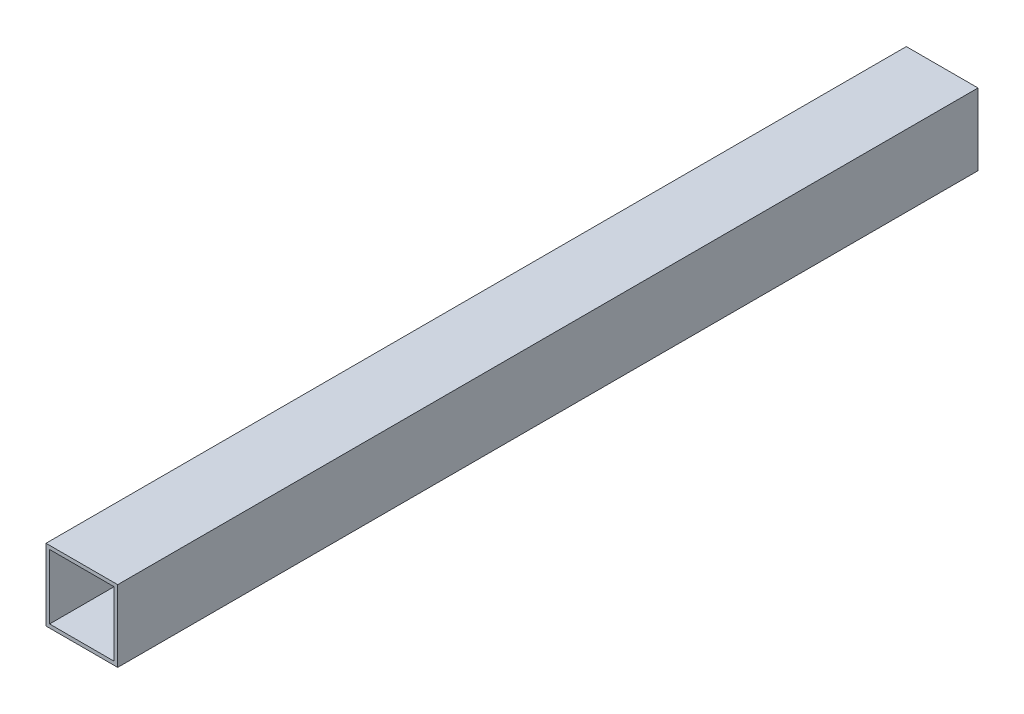
ISO-10303-21;
HEADER;
FILE_DESCRIPTION(('STEP AP214'),'2;1');
FILE_NAME('part.step','',(''),(''),'','','');
FILE_SCHEMA(('AUTOMOTIVE_DESIGN { 1 0 10303 214 1 1 1 1 }'));
ENDSEC;
DATA;
#1=APPLICATION_CONTEXT('core data for automotive mechanical design processes');
#2=APPLICATION_PROTOCOL_DEFINITION('international standard','automotive_design',2000,#1);
#3=PRODUCT_CONTEXT('',#1,'mechanical');
#4=PRODUCT('Part','Part','',(#3));
#5=PRODUCT_RELATED_PRODUCT_CATEGORY('part','',(#4));
#6=PRODUCT_DEFINITION_FORMATION('','',#4);
#7=PRODUCT_DEFINITION_CONTEXT('part definition',#1,'design');
#8=PRODUCT_DEFINITION('design','',#6,#7);
#9=PRODUCT_DEFINITION_SHAPE('','',#8);
#10=(LENGTH_UNIT() NAMED_UNIT(*) SI_UNIT(.MILLI.,.METRE.));
#11=(NAMED_UNIT(*) PLANE_ANGLE_UNIT() SI_UNIT($,.RADIAN.));
#12=(NAMED_UNIT(*) SI_UNIT($,.STERADIAN.) SOLID_ANGLE_UNIT());
#13=UNCERTAINTY_MEASURE_WITH_UNIT(LENGTH_MEASURE(1.E-05),#10,'distance_accuracy_value','');
#14=(GEOMETRIC_REPRESENTATION_CONTEXT(3) GLOBAL_UNCERTAINTY_ASSIGNED_CONTEXT((#13)) GLOBAL_UNIT_ASSIGNED_CONTEXT((#10,
#11,#12)) REPRESENTATION_CONTEXT('',''));
#15=CARTESIAN_POINT('',(0.,0.,0.));
#16=DIRECTION('',(0.,0.,1.));
#17=DIRECTION('',(1.,0.,0.));
#18=AXIS2_PLACEMENT_3D('',#15,#16,#17);
#19=CARTESIAN_POINT('',(0.,0.,300.));
#20=DIRECTION('',(0.,0.,-1.));
#21=DIRECTION('',(-1.,0.,0.));
#22=AXIS2_PLACEMENT_3D('',#19,#20,#21);
#23=PLANE('',#22);
#24=DIRECTION('',(0.,1.,0.));
#25=VECTOR('',#24,1.);
#26=CARTESIAN_POINT('',(25.,-25.,300.));
#27=LINE('',#26,#25);
#28=CARTESIAN_POINT('',(25.,-25.,300.));
#29=VERTEX_POINT('',#28);
#30=CARTESIAN_POINT('',(25.,25.,300.));
#31=VERTEX_POINT('',#30);
#32=EDGE_CURVE('E153',#29,#31,#27,.T.);
#33=ORIENTED_EDGE('',*,*,#32,.T.);
#34=DIRECTION('',(-1.,0.,0.));
#35=VECTOR('',#34,1.);
#36=CARTESIAN_POINT('',(-25.,25.,300.));
#37=LINE('',#36,#35);
#38=CARTESIAN_POINT('',(-25.,25.,300.));
#39=VERTEX_POINT('',#38);
#40=EDGE_CURVE('E157',#31,#39,#37,.T.);
#41=ORIENTED_EDGE('',*,*,#40,.T.);
#42=DIRECTION('',(0.,-1.,0.));
#43=VECTOR('',#42,1.);
#44=CARTESIAN_POINT('',(-25.,-25.,300.));
#45=LINE('',#44,#43);
#46=CARTESIAN_POINT('',(-25.,-25.,300.));
#47=VERTEX_POINT('',#46);
#48=EDGE_CURVE('E161',#39,#47,#45,.T.);
#49=ORIENTED_EDGE('',*,*,#48,.T.);
#50=DIRECTION('',(1.,0.,0.));
#51=VECTOR('',#50,1.);
#52=CARTESIAN_POINT('',(-25.,-25.,300.));
#53=LINE('',#52,#51);
#54=EDGE_CURVE('E164',#47,#29,#53,.T.);
#55=ORIENTED_EDGE('',*,*,#54,.T.);
#56=EDGE_LOOP('',(#33,#41,#49,#55));
#57=FACE_BOUND('',#56,.T.);
#58=DIRECTION('',(1.,0.,0.));
#59=VECTOR('',#58,1.);
#60=CARTESIAN_POINT('',(-22.5,-22.5,300.));
#61=LINE('',#60,#59);
#62=CARTESIAN_POINT('',(-22.5,-22.5,300.));
#63=VERTEX_POINT('',#62);
#64=CARTESIAN_POINT('',(22.5,-22.5,300.));
#65=VERTEX_POINT('',#64);
#66=EDGE_CURVE('E105',#63,#65,#61,.T.);
#67=ORIENTED_EDGE('',*,*,#66,.F.);
#68=DIRECTION('',(0.,-1.,0.));
#69=VECTOR('',#68,1.);
#70=CARTESIAN_POINT('',(-22.5,-22.5,300.));
#71=LINE('',#70,#69);
#72=CARTESIAN_POINT('',(-22.5,22.5,300.));
#73=VERTEX_POINT('',#72);
#74=EDGE_CURVE('E131',#73,#63,#71,.T.);
#75=ORIENTED_EDGE('',*,*,#74,.F.);
#76=DIRECTION('',(-1.,0.,0.));
#77=VECTOR('',#76,1.);
#78=CARTESIAN_POINT('',(-22.5,22.5,300.));
#79=LINE('',#78,#77);
#80=CARTESIAN_POINT('',(22.5,22.5,300.));
#81=VERTEX_POINT('',#80);
#82=EDGE_CURVE('E127',#81,#73,#79,.T.);
#83=ORIENTED_EDGE('',*,*,#82,.F.);
#84=DIRECTION('',(0.,1.,0.));
#85=VECTOR('',#84,1.);
#86=CARTESIAN_POINT('',(22.5,-22.5,300.));
#87=LINE('',#86,#85);
#88=EDGE_CURVE('E114',#65,#81,#87,.T.);
#89=ORIENTED_EDGE('',*,*,#88,.F.);
#90=EDGE_LOOP('',(#67,#75,#83,#89));
#91=FACE_BOUND('',#90,.T.);
#92=ADVANCED_FACE('F39',(#57,#91),#23,.F.);
#93=CARTESIAN_POINT('',(0.,0.,-300.));
#94=DIRECTION('',(0.,0.,-1.));
#95=DIRECTION('',(-1.,0.,0.));
#96=AXIS2_PLACEMENT_3D('',#93,#94,#95);
#97=PLANE('',#96);
#98=DIRECTION('',(0.,1.,0.));
#99=VECTOR('',#98,1.);
#100=CARTESIAN_POINT('',(25.,-25.,-300.));
#101=LINE('',#100,#99);
#102=CARTESIAN_POINT('',(25.,-25.,-300.));
#103=VERTEX_POINT('',#102);
#104=CARTESIAN_POINT('',(25.,25.,-300.));
#105=VERTEX_POINT('',#104);
#106=EDGE_CURVE('E123',#103,#105,#101,.T.);
#107=ORIENTED_EDGE('',*,*,#106,.F.);
#108=DIRECTION('',(1.,0.,0.));
#109=VECTOR('',#108,1.);
#110=CARTESIAN_POINT('',(-25.,-25.,-300.));
#111=LINE('',#110,#109);
#112=CARTESIAN_POINT('',(-25.,-25.,-300.));
#113=VERTEX_POINT('',#112);
#114=EDGE_CURVE('E158',#113,#103,#111,.T.);
#115=ORIENTED_EDGE('',*,*,#114,.F.);
#116=DIRECTION('',(0.,-1.,0.));
#117=VECTOR('',#116,1.);
#118=CARTESIAN_POINT('',(-25.,-25.,-300.));
#119=LINE('',#118,#117);
#120=CARTESIAN_POINT('',(-25.,25.,-300.));
#121=VERTEX_POINT('',#120);
#122=EDGE_CURVE('E174',#121,#113,#119,.T.);
#123=ORIENTED_EDGE('',*,*,#122,.F.);
#124=DIRECTION('',(-1.,0.,0.));
#125=VECTOR('',#124,1.);
#126=CARTESIAN_POINT('',(-25.,25.,-300.));
#127=LINE('',#126,#125);
#128=EDGE_CURVE('E171',#105,#121,#127,.T.);
#129=ORIENTED_EDGE('',*,*,#128,.F.);
#130=EDGE_LOOP('',(#107,#115,#123,#129));
#131=FACE_BOUND('',#130,.T.);
#132=DIRECTION('',(0.,-1.,0.));
#133=VECTOR('',#132,1.);
#134=CARTESIAN_POINT('',(-22.5,-22.5,-300.));
#135=LINE('',#134,#133);
#136=CARTESIAN_POINT('',(-22.5,22.5,-300.));
#137=VERTEX_POINT('',#136);
#138=CARTESIAN_POINT('',(-22.5,-22.5,-300.));
#139=VERTEX_POINT('',#138);
#140=EDGE_CURVE('E115',#137,#139,#135,.T.);
#141=ORIENTED_EDGE('',*,*,#140,.T.);
#142=DIRECTION('',(1.,0.,0.));
#143=VECTOR('',#142,1.);
#144=CARTESIAN_POINT('',(-22.5,-22.5,-300.));
#145=LINE('',#144,#143);
#146=CARTESIAN_POINT('',(22.5,-22.5,-300.));
#147=VERTEX_POINT('',#146);
#148=EDGE_CURVE('E63',#139,#147,#145,.T.);
#149=ORIENTED_EDGE('',*,*,#148,.T.);
#150=DIRECTION('',(0.,1.,0.));
#151=VECTOR('',#150,1.);
#152=CARTESIAN_POINT('',(22.5,-22.5,-300.));
#153=LINE('',#152,#151);
#154=CARTESIAN_POINT('',(22.5,22.5,-300.));
#155=VERTEX_POINT('',#154);
#156=EDGE_CURVE('E121',#147,#155,#153,.T.);
#157=ORIENTED_EDGE('',*,*,#156,.T.);
#158=DIRECTION('',(-1.,0.,0.));
#159=VECTOR('',#158,1.);
#160=CARTESIAN_POINT('',(-22.5,22.5,-300.));
#161=LINE('',#160,#159);
#162=EDGE_CURVE('E140',#155,#137,#161,.T.);
#163=ORIENTED_EDGE('',*,*,#162,.T.);
#164=EDGE_LOOP('',(#141,#149,#157,#163));
#165=FACE_BOUND('',#164,.T.);
#166=ADVANCED_FACE('F197',(#131,#165),#97,.T.);
#167=CARTESIAN_POINT('',(25.,-25.,300.));
#168=DIRECTION('',(-1.,0.,0.));
#169=DIRECTION('',(0.,0.,1.));
#170=AXIS2_PLACEMENT_3D('',#167,#168,#169);
#171=PLANE('',#170);
#172=ORIENTED_EDGE('',*,*,#106,.T.);
#173=DIRECTION('',(0.,0.,-1.));
#174=VECTOR('',#173,1.);
#175=CARTESIAN_POINT('',(25.,25.,300.));
#176=LINE('',#175,#174);
#177=EDGE_CURVE('E11',#31,#105,#176,.T.);
#178=ORIENTED_EDGE('',*,*,#177,.F.);
#179=ORIENTED_EDGE('',*,*,#32,.F.);
#180=DIRECTION('',(0.,0.,-1.));
#181=VECTOR('',#180,1.);
#182=CARTESIAN_POINT('',(25.,-25.,300.));
#183=LINE('',#182,#181);
#184=EDGE_CURVE('E167',#29,#103,#183,.T.);
#185=ORIENTED_EDGE('',*,*,#184,.T.);
#186=EDGE_LOOP('',(#172,#178,#179,#185));
#187=FACE_BOUND('',#186,.T.);
#188=ADVANCED_FACE('F41',(#187),#171,.F.);
#189=CARTESIAN_POINT('',(-25.,25.,300.));
#190=DIRECTION('',(0.,-1.,0.));
#191=DIRECTION('',(0.,0.,-1.));
#192=AXIS2_PLACEMENT_3D('',#189,#190,#191);
#193=PLANE('',#192);
#194=ORIENTED_EDGE('',*,*,#128,.T.);
#195=DIRECTION('',(0.,0.,-1.));
#196=VECTOR('',#195,1.);
#197=CARTESIAN_POINT('',(-25.,25.,300.));
#198=LINE('',#197,#196);
#199=EDGE_CURVE('E48',#39,#121,#198,.T.);
#200=ORIENTED_EDGE('',*,*,#199,.F.);
#201=ORIENTED_EDGE('',*,*,#40,.F.);
#202=ORIENTED_EDGE('',*,*,#177,.T.);
#203=EDGE_LOOP('',(#194,#200,#201,#202));
#204=FACE_BOUND('',#203,.T.);
#205=ADVANCED_FACE('F207',(#204),#193,.F.);
#206=CARTESIAN_POINT('',(-25.,-25.,300.));
#207=DIRECTION('',(1.,0.,0.));
#208=DIRECTION('',(0.,0.,-1.));
#209=AXIS2_PLACEMENT_3D('',#206,#207,#208);
#210=PLANE('',#209);
#211=ORIENTED_EDGE('',*,*,#122,.T.);
#212=DIRECTION('',(0.,0.,-1.));
#213=VECTOR('',#212,1.);
#214=CARTESIAN_POINT('',(-25.,-25.,300.));
#215=LINE('',#214,#213);
#216=EDGE_CURVE('E182',#47,#113,#215,.T.);
#217=ORIENTED_EDGE('',*,*,#216,.F.);
#218=ORIENTED_EDGE('',*,*,#48,.F.);
#219=ORIENTED_EDGE('',*,*,#199,.T.);
#220=EDGE_LOOP('',(#211,#217,#218,#219));
#221=FACE_BOUND('',#220,.T.);
#222=ADVANCED_FACE('F191',(#221),#210,.F.);
#223=CARTESIAN_POINT('',(-25.,-25.,300.));
#224=DIRECTION('',(0.,1.,0.));
#225=DIRECTION('',(0.,0.,1.));
#226=AXIS2_PLACEMENT_3D('',#223,#224,#225);
#227=PLANE('',#226);
#228=ORIENTED_EDGE('',*,*,#114,.T.);
#229=ORIENTED_EDGE('',*,*,#184,.F.);
#230=ORIENTED_EDGE('',*,*,#54,.F.);
#231=ORIENTED_EDGE('',*,*,#216,.T.);
#232=EDGE_LOOP('',(#228,#229,#230,#231));
#233=FACE_BOUND('',#232,.T.);
#234=ADVANCED_FACE('F201',(#233),#227,.F.);
#235=CARTESIAN_POINT('',(-22.5,-22.5,300.));
#236=DIRECTION('',(0.,1.,0.));
#237=DIRECTION('',(0.,0.,1.));
#238=AXIS2_PLACEMENT_3D('',#235,#236,#237);
#239=PLANE('',#238);
#240=ORIENTED_EDGE('',*,*,#148,.F.);
#241=DIRECTION('',(0.,0.,-1.));
#242=VECTOR('',#241,1.);
#243=CARTESIAN_POINT('',(-22.5,-22.5,300.));
#244=LINE('',#243,#242);
#245=EDGE_CURVE('E109',#63,#139,#244,.T.);
#246=ORIENTED_EDGE('',*,*,#245,.F.);
#247=ORIENTED_EDGE('',*,*,#66,.T.);
#248=DIRECTION('',(0.,0.,-1.));
#249=VECTOR('',#248,1.);
#250=CARTESIAN_POINT('',(22.5,-22.5,300.));
#251=LINE('',#250,#249);
#252=EDGE_CURVE('E108',#65,#147,#251,.T.);
#253=ORIENTED_EDGE('',*,*,#252,.T.);
#254=EDGE_LOOP('',(#240,#246,#247,#253));
#255=FACE_BOUND('',#254,.T.);
#256=ADVANCED_FACE('F107',(#255),#239,.T.);
#257=CARTESIAN_POINT('',(22.5,-22.5,300.));
#258=DIRECTION('',(-1.,0.,0.));
#259=DIRECTION('',(0.,-1.,0.));
#260=AXIS2_PLACEMENT_3D('',#257,#258,#259);
#261=PLANE('',#260);
#262=ORIENTED_EDGE('',*,*,#156,.F.);
#263=ORIENTED_EDGE('',*,*,#252,.F.);
#264=ORIENTED_EDGE('',*,*,#88,.T.);
#265=DIRECTION('',(0.,0.,-1.));
#266=VECTOR('',#265,1.);
#267=CARTESIAN_POINT('',(22.5,22.5,300.));
#268=LINE('',#267,#266);
#269=EDGE_CURVE('E124',#81,#155,#268,.T.);
#270=ORIENTED_EDGE('',*,*,#269,.T.);
#271=EDGE_LOOP('',(#262,#263,#264,#270));
#272=FACE_BOUND('',#271,.T.);
#273=ADVANCED_FACE('F118',(#272),#261,.T.);
#274=CARTESIAN_POINT('',(-22.5,22.5,300.));
#275=DIRECTION('',(0.,-1.,0.));
#276=DIRECTION('',(1.,0.,0.));
#277=AXIS2_PLACEMENT_3D('',#274,#275,#276);
#278=PLANE('',#277);
#279=ORIENTED_EDGE('',*,*,#162,.F.);
#280=ORIENTED_EDGE('',*,*,#269,.F.);
#281=ORIENTED_EDGE('',*,*,#82,.T.);
#282=DIRECTION('',(0.,0.,-1.));
#283=VECTOR('',#282,1.);
#284=CARTESIAN_POINT('',(-22.5,22.5,300.));
#285=LINE('',#284,#283);
#286=EDGE_CURVE('E55',#73,#137,#285,.T.);
#287=ORIENTED_EDGE('',*,*,#286,.T.);
#288=EDGE_LOOP('',(#279,#280,#281,#287));
#289=FACE_BOUND('',#288,.T.);
#290=ADVANCED_FACE('F230',(#289),#278,.T.);
#291=CARTESIAN_POINT('',(-22.5,-22.5,300.));
#292=DIRECTION('',(1.,0.,0.));
#293=DIRECTION('',(0.,0.,-1.));
#294=AXIS2_PLACEMENT_3D('',#291,#292,#293);
#295=PLANE('',#294);
#296=ORIENTED_EDGE('',*,*,#140,.F.);
#297=ORIENTED_EDGE('',*,*,#286,.F.);
#298=ORIENTED_EDGE('',*,*,#74,.T.);
#299=ORIENTED_EDGE('',*,*,#245,.T.);
#300=EDGE_LOOP('',(#296,#297,#298,#299));
#301=FACE_BOUND('',#300,.T.);
#302=ADVANCED_FACE('F234',(#301),#295,.T.);
#303=CLOSED_SHELL('',(#92,#166,#188,#205,#222,#234,#256,#273,#290,#302));
#304=MANIFOLD_SOLID_BREP('B2',#303);
#305=ADVANCED_BREP_SHAPE_REPRESENTATION('',(#18,#304),#14);
#306=SHAPE_DEFINITION_REPRESENTATION(#9,#305);
ENDSEC;
END-ISO-10303-21;
